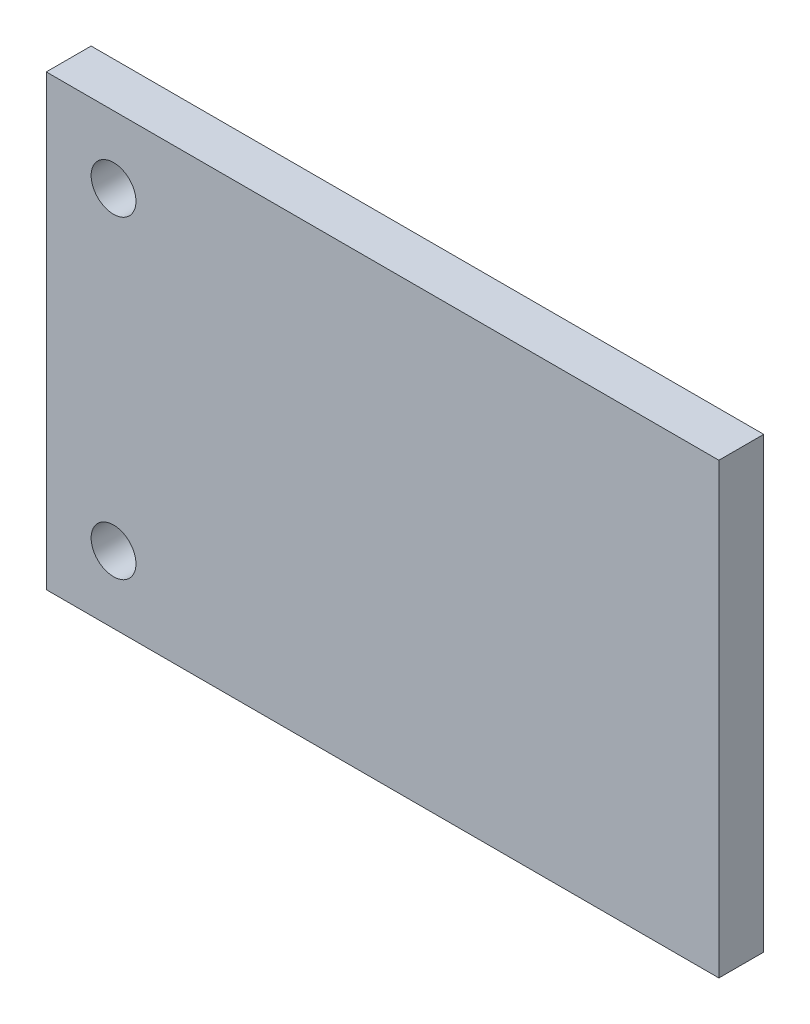
ISO-10303-21;
HEADER;
FILE_DESCRIPTION(('STEP AP214'),'2;1');
FILE_NAME('part.step','',(''),(''),'','','');
FILE_SCHEMA(('AUTOMOTIVE_DESIGN { 1 0 10303 214 1 1 1 1 }'));
ENDSEC;
DATA;
#1=APPLICATION_CONTEXT('core data for automotive mechanical design processes');
#2=APPLICATION_PROTOCOL_DEFINITION('international standard','automotive_design',2000,#1);
#3=PRODUCT_CONTEXT('',#1,'mechanical');
#4=PRODUCT('Part','Part','',(#3));
#5=PRODUCT_RELATED_PRODUCT_CATEGORY('part','',(#4));
#6=PRODUCT_DEFINITION_FORMATION('','',#4);
#7=PRODUCT_DEFINITION_CONTEXT('part definition',#1,'design');
#8=PRODUCT_DEFINITION('design','',#6,#7);
#9=PRODUCT_DEFINITION_SHAPE('','',#8);
#10=(LENGTH_UNIT() NAMED_UNIT(*) SI_UNIT(.MILLI.,.METRE.));
#11=(NAMED_UNIT(*) PLANE_ANGLE_UNIT() SI_UNIT($,.RADIAN.));
#12=(NAMED_UNIT(*) SI_UNIT($,.STERADIAN.) SOLID_ANGLE_UNIT());
#13=UNCERTAINTY_MEASURE_WITH_UNIT(LENGTH_MEASURE(1.E-05),#10,'distance_accuracy_value','');
#14=(GEOMETRIC_REPRESENTATION_CONTEXT(3) GLOBAL_UNCERTAINTY_ASSIGNED_CONTEXT((#13)) GLOBAL_UNIT_ASSIGNED_CONTEXT((#10,
#11,#12)) REPRESENTATION_CONTEXT('',''));
#15=CARTESIAN_POINT('',(0.,0.,0.));
#16=DIRECTION('',(0.,0.,1.));
#17=DIRECTION('',(1.,0.,0.));
#18=AXIS2_PLACEMENT_3D('',#15,#16,#17);
#19=CARTESIAN_POINT('',(0.,0.,20.));
#20=DIRECTION('',(0.,0.,1.));
#21=DIRECTION('',(1.,0.,0.));
#22=AXIS2_PLACEMENT_3D('',#19,#20,#21);
#23=PLANE('',#22);
#24=CARTESIAN_POINT('',(30.,-170.,20.));
#25=DIRECTION('',(0.,0.,1.));
#26=DIRECTION('',(1.,0.,0.));
#27=AXIS2_PLACEMENT_3D('',#24,#25,#26);
#28=CIRCLE('',#27,10.);
#29=CARTESIAN_POINT('',(40.,-170.,20.));
#30=VERTEX_POINT('',#29);
#31=EDGE_CURVE('E136',#30,#30,#28,.T.);
#32=ORIENTED_EDGE('',*,*,#31,.F.);
#33=EDGE_LOOP('',(#32));
#34=FACE_BOUND('',#33,.T.);
#35=DIRECTION('',(0.,-1.,0.));
#36=VECTOR('',#35,1.);
#37=CARTESIAN_POINT('',(0.,0.,20.));
#38=LINE('',#37,#36);
#39=CARTESIAN_POINT('',(0.,0.,20.));
#40=VERTEX_POINT('',#39);
#41=CARTESIAN_POINT('',(0.,-200.,20.));
#42=VERTEX_POINT('',#41);
#43=EDGE_CURVE('E104',#40,#42,#38,.T.);
#44=ORIENTED_EDGE('',*,*,#43,.T.);
#45=DIRECTION('',(1.,0.,0.));
#46=VECTOR('',#45,1.);
#47=CARTESIAN_POINT('',(0.,-200.,20.));
#48=LINE('',#47,#46);
#49=CARTESIAN_POINT('',(300.,-200.,20.));
#50=VERTEX_POINT('',#49);
#51=EDGE_CURVE('E99',#42,#50,#48,.T.);
#52=ORIENTED_EDGE('',*,*,#51,.T.);
#53=DIRECTION('',(0.,1.,0.));
#54=VECTOR('',#53,1.);
#55=CARTESIAN_POINT('',(300.,0.,20.));
#56=LINE('',#55,#54);
#57=CARTESIAN_POINT('',(300.,0.,20.));
#58=VERTEX_POINT('',#57);
#59=EDGE_CURVE('E102',#50,#58,#56,.T.);
#60=ORIENTED_EDGE('',*,*,#59,.T.);
#61=DIRECTION('',(-1.,0.,0.));
#62=VECTOR('',#61,1.);
#63=CARTESIAN_POINT('',(0.,0.,20.));
#64=LINE('',#63,#62);
#65=EDGE_CURVE('E67',#58,#40,#64,.T.);
#66=ORIENTED_EDGE('',*,*,#65,.T.);
#67=EDGE_LOOP('',(#44,#52,#60,#66));
#68=FACE_BOUND('',#67,.T.);
#69=CARTESIAN_POINT('',(30.,-30.,20.));
#70=DIRECTION('',(0.,0.,1.));
#71=DIRECTION('',(1.,0.,0.));
#72=AXIS2_PLACEMENT_3D('',#69,#70,#71);
#73=CIRCLE('',#72,10.);
#74=CARTESIAN_POINT('',(40.,-30.,20.));
#75=VERTEX_POINT('',#74);
#76=EDGE_CURVE('E134',#75,#75,#73,.T.);
#77=ORIENTED_EDGE('',*,*,#76,.F.);
#78=EDGE_LOOP('',(#77));
#79=FACE_BOUND('',#78,.T.);
#80=ADVANCED_FACE('F49',(#34,#68,#79),#23,.T.);
#81=CARTESIAN_POINT('',(0.,0.,0.));
#82=DIRECTION('',(0.,0.,1.));
#83=DIRECTION('',(1.,0.,0.));
#84=AXIS2_PLACEMENT_3D('',#81,#82,#83);
#85=PLANE('',#84);
#86=DIRECTION('',(0.,-1.,0.));
#87=VECTOR('',#86,1.);
#88=CARTESIAN_POINT('',(0.,0.,0.));
#89=LINE('',#88,#87);
#90=CARTESIAN_POINT('',(0.,0.,0.));
#91=VERTEX_POINT('',#90);
#92=CARTESIAN_POINT('',(0.,-200.,0.));
#93=VERTEX_POINT('',#92);
#94=EDGE_CURVE('E141',#91,#93,#89,.T.);
#95=ORIENTED_EDGE('',*,*,#94,.F.);
#96=DIRECTION('',(-1.,0.,0.));
#97=VECTOR('',#96,1.);
#98=CARTESIAN_POINT('',(0.,0.,0.));
#99=LINE('',#98,#97);
#100=CARTESIAN_POINT('',(300.,0.,0.));
#101=VERTEX_POINT('',#100);
#102=EDGE_CURVE('E92',#101,#91,#99,.T.);
#103=ORIENTED_EDGE('',*,*,#102,.F.);
#104=DIRECTION('',(0.,1.,0.));
#105=VECTOR('',#104,1.);
#106=CARTESIAN_POINT('',(300.,0.,0.));
#107=LINE('',#106,#105);
#108=CARTESIAN_POINT('',(300.,-200.,0.));
#109=VERTEX_POINT('',#108);
#110=EDGE_CURVE('E86',#109,#101,#107,.T.);
#111=ORIENTED_EDGE('',*,*,#110,.F.);
#112=DIRECTION('',(1.,0.,0.));
#113=VECTOR('',#112,1.);
#114=CARTESIAN_POINT('',(0.,-200.,0.));
#115=LINE('',#114,#113);
#116=EDGE_CURVE('E109',#93,#109,#115,.T.);
#117=ORIENTED_EDGE('',*,*,#116,.F.);
#118=EDGE_LOOP('',(#95,#103,#111,#117));
#119=FACE_BOUND('',#118,.T.);
#120=CARTESIAN_POINT('',(30.,-170.,0.));
#121=DIRECTION('',(0.,0.,1.));
#122=DIRECTION('',(1.,0.,0.));
#123=AXIS2_PLACEMENT_3D('',#120,#121,#122);
#124=CIRCLE('',#123,10.);
#125=CARTESIAN_POINT('',(40.,-170.,0.));
#126=VERTEX_POINT('',#125);
#127=EDGE_CURVE('E142',#126,#126,#124,.T.);
#128=ORIENTED_EDGE('',*,*,#127,.T.);
#129=EDGE_LOOP('',(#128));
#130=FACE_BOUND('',#129,.T.);
#131=CARTESIAN_POINT('',(30.,-30.,0.));
#132=DIRECTION('',(0.,0.,1.));
#133=DIRECTION('',(1.,0.,0.));
#134=AXIS2_PLACEMENT_3D('',#131,#132,#133);
#135=CIRCLE('',#134,10.);
#136=CARTESIAN_POINT('',(40.,-30.,0.));
#137=VERTEX_POINT('',#136);
#138=EDGE_CURVE('E129',#137,#137,#135,.T.);
#139=ORIENTED_EDGE('',*,*,#138,.T.);
#140=EDGE_LOOP('',(#139));
#141=FACE_BOUND('',#140,.T.);
#142=ADVANCED_FACE('F161',(#119,#130,#141),#85,.F.);
#143=CARTESIAN_POINT('',(0.,0.,20.));
#144=DIRECTION('',(1.,0.,0.));
#145=DIRECTION('',(0.,1.,0.));
#146=AXIS2_PLACEMENT_3D('',#143,#144,#145);
#147=PLANE('',#146);
#148=ORIENTED_EDGE('',*,*,#94,.T.);
#149=DIRECTION('',(0.,0.,-1.));
#150=VECTOR('',#149,1.);
#151=CARTESIAN_POINT('',(0.,-200.,20.));
#152=LINE('',#151,#150);
#153=EDGE_CURVE('E12',#42,#93,#152,.T.);
#154=ORIENTED_EDGE('',*,*,#153,.F.);
#155=ORIENTED_EDGE('',*,*,#43,.F.);
#156=DIRECTION('',(0.,0.,-1.));
#157=VECTOR('',#156,1.);
#158=CARTESIAN_POINT('',(0.,0.,20.));
#159=LINE('',#158,#157);
#160=EDGE_CURVE('E116',#40,#91,#159,.T.);
#161=ORIENTED_EDGE('',*,*,#160,.T.);
#162=EDGE_LOOP('',(#148,#154,#155,#161));
#163=FACE_BOUND('',#162,.T.);
#164=ADVANCED_FACE('F51',(#163),#147,.F.);
#165=CARTESIAN_POINT('',(0.,-200.,20.));
#166=DIRECTION('',(0.,1.,0.));
#167=DIRECTION('',(0.,0.,1.));
#168=AXIS2_PLACEMENT_3D('',#165,#166,#167);
#169=PLANE('',#168);
#170=ORIENTED_EDGE('',*,*,#116,.T.);
#171=DIRECTION('',(0.,0.,-1.));
#172=VECTOR('',#171,1.);
#173=CARTESIAN_POINT('',(300.,-200.,20.));
#174=LINE('',#173,#172);
#175=EDGE_CURVE('E59',#50,#109,#174,.T.);
#176=ORIENTED_EDGE('',*,*,#175,.F.);
#177=ORIENTED_EDGE('',*,*,#51,.F.);
#178=ORIENTED_EDGE('',*,*,#153,.T.);
#179=EDGE_LOOP('',(#170,#176,#177,#178));
#180=FACE_BOUND('',#179,.T.);
#181=ADVANCED_FACE('F108',(#180),#169,.F.);
#182=CARTESIAN_POINT('',(300.,0.,20.));
#183=DIRECTION('',(-1.,0.,0.));
#184=DIRECTION('',(0.,0.,1.));
#185=AXIS2_PLACEMENT_3D('',#182,#183,#184);
#186=PLANE('',#185);
#187=ORIENTED_EDGE('',*,*,#110,.T.);
#188=DIRECTION('',(0.,0.,-1.));
#189=VECTOR('',#188,1.);
#190=CARTESIAN_POINT('',(300.,0.,20.));
#191=LINE('',#190,#189);
#192=EDGE_CURVE('E111',#58,#101,#191,.T.);
#193=ORIENTED_EDGE('',*,*,#192,.F.);
#194=ORIENTED_EDGE('',*,*,#59,.F.);
#195=ORIENTED_EDGE('',*,*,#175,.T.);
#196=EDGE_LOOP('',(#187,#193,#194,#195));
#197=FACE_BOUND('',#196,.T.);
#198=ADVANCED_FACE('F112',(#197),#186,.F.);
#199=CARTESIAN_POINT('',(0.,0.,20.));
#200=DIRECTION('',(0.,-1.,0.));
#201=DIRECTION('',(0.,0.,-1.));
#202=AXIS2_PLACEMENT_3D('',#199,#200,#201);
#203=PLANE('',#202);
#204=ORIENTED_EDGE('',*,*,#102,.T.);
#205=ORIENTED_EDGE('',*,*,#160,.F.);
#206=ORIENTED_EDGE('',*,*,#65,.F.);
#207=ORIENTED_EDGE('',*,*,#192,.T.);
#208=EDGE_LOOP('',(#204,#205,#206,#207));
#209=FACE_BOUND('',#208,.T.);
#210=ADVANCED_FACE('F158',(#209),#203,.F.);
#211=CARTESIAN_POINT('',(30.,-170.,20.));
#212=DIRECTION('',(0.,0.,-1.));
#213=DIRECTION('',(-1.,0.,0.));
#214=AXIS2_PLACEMENT_3D('',#211,#212,#213);
#215=CYLINDRICAL_SURFACE('',#214,10.);
#216=ORIENTED_EDGE('',*,*,#31,.T.);
#217=EDGE_LOOP('',(#216));
#218=FACE_BOUND('',#217,.T.);
#219=ORIENTED_EDGE('',*,*,#127,.F.);
#220=EDGE_LOOP('',(#219));
#221=FACE_BOUND('',#220,.T.);
#222=ADVANCED_FACE('F182',(#218,#221),#215,.F.);
#223=CARTESIAN_POINT('',(30.,-30.,20.));
#224=DIRECTION('',(0.,0.,-1.));
#225=DIRECTION('',(-1.,0.,0.));
#226=AXIS2_PLACEMENT_3D('',#223,#224,#225);
#227=CYLINDRICAL_SURFACE('',#226,10.);
#228=ORIENTED_EDGE('',*,*,#76,.T.);
#229=EDGE_LOOP('',(#228));
#230=FACE_BOUND('',#229,.T.);
#231=ORIENTED_EDGE('',*,*,#138,.F.);
#232=EDGE_LOOP('',(#231));
#233=FACE_BOUND('',#232,.T.);
#234=ADVANCED_FACE('F171',(#230,#233),#227,.F.);
#235=CLOSED_SHELL('',(#80,#142,#164,#181,#198,#210,#222,#234));
#236=MANIFOLD_SOLID_BREP('B2',#235);
#237=ADVANCED_BREP_SHAPE_REPRESENTATION('',(#18,#236),#14);
#238=SHAPE_DEFINITION_REPRESENTATION(#9,#237);
ENDSEC;
END-ISO-10303-21;
